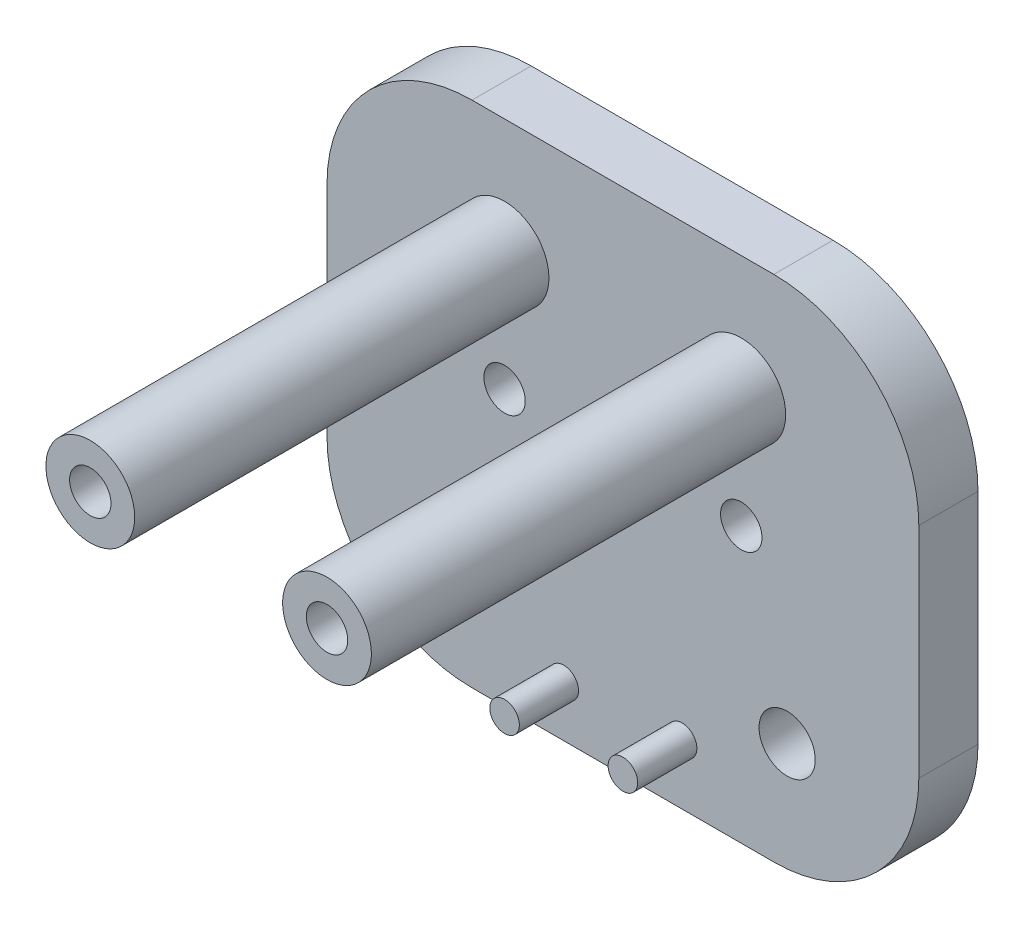
ISO-10303-21;
HEADER;
FILE_DESCRIPTION(('STEP AP214'),'2;1');
FILE_NAME('part.step','',(''),(''),'','','');
FILE_SCHEMA(('AUTOMOTIVE_DESIGN { 1 0 10303 214 1 1 1 1 }'));
ENDSEC;
DATA;
#1=APPLICATION_CONTEXT('core data for automotive mechanical design processes');
#2=APPLICATION_PROTOCOL_DEFINITION('international standard','automotive_design',2000,#1);
#3=PRODUCT_CONTEXT('',#1,'mechanical');
#4=PRODUCT('Part','Part','',(#3));
#5=PRODUCT_RELATED_PRODUCT_CATEGORY('part','',(#4));
#6=PRODUCT_DEFINITION_FORMATION('','',#4);
#7=PRODUCT_DEFINITION_CONTEXT('part definition',#1,'design');
#8=PRODUCT_DEFINITION('design','',#6,#7);
#9=PRODUCT_DEFINITION_SHAPE('','',#8);
#10=(LENGTH_UNIT() NAMED_UNIT(*) SI_UNIT(.MILLI.,.METRE.));
#11=(NAMED_UNIT(*) PLANE_ANGLE_UNIT() SI_UNIT($,.RADIAN.));
#12=(NAMED_UNIT(*) SI_UNIT($,.STERADIAN.) SOLID_ANGLE_UNIT());
#13=UNCERTAINTY_MEASURE_WITH_UNIT(LENGTH_MEASURE(1.E-05),#10,'distance_accuracy_value','');
#14=(GEOMETRIC_REPRESENTATION_CONTEXT(3) GLOBAL_UNCERTAINTY_ASSIGNED_CONTEXT((#13)) GLOBAL_UNIT_ASSIGNED_CONTEXT((#10,
#11,#12)) REPRESENTATION_CONTEXT('',''));
#15=CARTESIAN_POINT('',(0.,0.,0.));
#16=DIRECTION('',(0.,0.,1.));
#17=DIRECTION('',(1.,0.,0.));
#18=AXIS2_PLACEMENT_3D('',#15,#16,#17);
#19=CARTESIAN_POINT('',(-25.5,26.3663986315752,76.));
#20=DIRECTION('',(0.,0.,1.));
#21=DIRECTION('',(1.,0.,0.));
#22=AXIS2_PLACEMENT_3D('',#19,#20,#21);
#23=PLANE('',#22);
#24=CARTESIAN_POINT('',(-20.,46.4509224089446,76.));
#25=DIRECTION('',(0.,0.,1.));
#26=DIRECTION('',(1.,0.,0.));
#27=AXIS2_PLACEMENT_3D('',#24,#25,#26);
#28=CIRCLE('',#27,3.5);
#29=CARTESIAN_POINT('',(-16.5,46.4509224089446,76.));
#30=VERTEX_POINT('',#29);
#31=EDGE_CURVE('E198',#30,#30,#28,.T.);
#32=ORIENTED_EDGE('',*,*,#31,.F.);
#33=EDGE_LOOP('',(#32));
#34=FACE_BOUND('',#33,.T.);
#35=CARTESIAN_POINT('',(-20.,46.4509224089446,76.));
#36=DIRECTION('',(0.,0.,1.));
#37=DIRECTION('',(1.,0.,0.));
#38=AXIS2_PLACEMENT_3D('',#35,#36,#37);
#39=CIRCLE('',#38,7.5);
#40=CARTESIAN_POINT('',(-12.5,46.4509224089446,76.));
#41=VERTEX_POINT('',#40);
#42=EDGE_CURVE('E194',#41,#41,#39,.T.);
#43=ORIENTED_EDGE('',*,*,#42,.T.);
#44=EDGE_LOOP('',(#43));
#45=FACE_BOUND('',#44,.T.);
#46=ADVANCED_FACE('F44',(#34,#45),#23,.T.);
#47=CARTESIAN_POINT('',(-50.,66.,-4.));
#48=DIRECTION('',(0.,1.,0.));
#49=DIRECTION('',(0.,0.,1.));
#50=AXIS2_PLACEMENT_3D('',#47,#48,#49);
#51=PLANE('',#50);
#52=DIRECTION('',(-1.,0.,0.));
#53=VECTOR('',#52,1.);
#54=CARTESIAN_POINT('',(25.5,66.,6.00000000000001));
#55=LINE('',#54,#53);
#56=CARTESIAN_POINT('',(25.5,66.,6.00000000000001));
#57=VERTEX_POINT('',#56);
#58=CARTESIAN_POINT('',(-25.5,66.,6.00000000000001));
#59=VERTEX_POINT('',#58);
#60=EDGE_CURVE('E48',#57,#59,#55,.T.);
#61=ORIENTED_EDGE('',*,*,#60,.F.);
#62=DIRECTION('',(0.,0.,1.));
#63=VECTOR('',#62,1.);
#64=CARTESIAN_POINT('',(25.5,66.,-4.));
#65=LINE('',#64,#63);
#66=CARTESIAN_POINT('',(25.5,66.,-4.));
#67=VERTEX_POINT('',#66);
#68=EDGE_CURVE('E55',#57,#67,#65,.F.);
#69=ORIENTED_EDGE('',*,*,#68,.T.);
#70=DIRECTION('',(-1.,0.,0.));
#71=VECTOR('',#70,1.);
#72=CARTESIAN_POINT('',(-50.,66.,-4.));
#73=LINE('',#72,#71);
#74=CARTESIAN_POINT('',(-25.5,66.,-4.));
#75=VERTEX_POINT('',#74);
#76=EDGE_CURVE('E114',#67,#75,#73,.T.);
#77=ORIENTED_EDGE('',*,*,#76,.T.);
#78=DIRECTION('',(0.,0.,1.));
#79=VECTOR('',#78,1.);
#80=CARTESIAN_POINT('',(-25.5,66.,-4.));
#81=LINE('',#80,#79);
#82=EDGE_CURVE('E12',#75,#59,#81,.T.);
#83=ORIENTED_EDGE('',*,*,#82,.T.);
#84=EDGE_LOOP('',(#61,#69,#77,#83));
#85=FACE_BOUND('',#84,.T.);
#86=ADVANCED_FACE('F113',(#85),#51,.T.);
#87=CARTESIAN_POINT('',(-25.5,41.5,-4.));
#88=DIRECTION('',(0.,0.,1.));
#89=DIRECTION('',(1.,0.,0.));
#90=AXIS2_PLACEMENT_3D('',#87,#88,#89);
#91=CYLINDRICAL_SURFACE('',#90,24.5);
#92=CARTESIAN_POINT('',(-25.5,41.5,6.));
#93=DIRECTION('',(0.,0.,-1.));
#94=DIRECTION('',(-1.,0.,0.));
#95=AXIS2_PLACEMENT_3D('',#92,#93,#94);
#96=CIRCLE('',#95,24.5);
#97=CARTESIAN_POINT('',(-50.,41.5,6.));
#98=VERTEX_POINT('',#97);
#99=EDGE_CURVE('E96',#59,#98,#96,.F.);
#100=ORIENTED_EDGE('',*,*,#99,.F.);
#101=ORIENTED_EDGE('',*,*,#82,.F.);
#102=CARTESIAN_POINT('',(-25.5,41.5,-4.));
#103=DIRECTION('',(0.,0.,-1.));
#104=DIRECTION('',(-1.,0.,0.));
#105=AXIS2_PLACEMENT_3D('',#102,#103,#104);
#106=CIRCLE('',#105,24.5);
#107=CARTESIAN_POINT('',(-50.,41.5,-4.));
#108=VERTEX_POINT('',#107);
#109=EDGE_CURVE('E64',#108,#75,#106,.T.);
#110=ORIENTED_EDGE('',*,*,#109,.F.);
#111=DIRECTION('',(0.,0.,1.));
#112=VECTOR('',#111,1.);
#113=CARTESIAN_POINT('',(-50.,41.5,-4.));
#114=LINE('',#113,#112);
#115=EDGE_CURVE('E100',#98,#108,#114,.F.);
#116=ORIENTED_EDGE('',*,*,#115,.F.);
#117=EDGE_LOOP('',(#100,#101,#110,#116));
#118=FACE_BOUND('',#117,.T.);
#119=ADVANCED_FACE('F97',(#118),#91,.T.);
#120=CARTESIAN_POINT('',(25.5,41.5,-4.));
#121=DIRECTION('',(0.,0.,1.));
#122=DIRECTION('',(1.,0.,0.));
#123=AXIS2_PLACEMENT_3D('',#120,#121,#122);
#124=CYLINDRICAL_SURFACE('',#123,24.5);
#125=ORIENTED_EDGE('',*,*,#68,.F.);
#126=CARTESIAN_POINT('',(25.5,41.5,6.));
#127=DIRECTION('',(0.,0.,-1.));
#128=DIRECTION('',(-1.,0.,0.));
#129=AXIS2_PLACEMENT_3D('',#126,#127,#128);
#130=CIRCLE('',#129,24.5);
#131=CARTESIAN_POINT('',(50.,41.5,6.));
#132=VERTEX_POINT('',#131);
#133=EDGE_CURVE('E86',#132,#57,#130,.F.);
#134=ORIENTED_EDGE('',*,*,#133,.F.);
#135=DIRECTION('',(0.,0.,1.));
#136=VECTOR('',#135,1.);
#137=CARTESIAN_POINT('',(50.,41.5,-4.));
#138=LINE('',#137,#136);
#139=CARTESIAN_POINT('',(50.,41.5,-4.));
#140=VERTEX_POINT('',#139);
#141=EDGE_CURVE('E135',#140,#132,#138,.T.);
#142=ORIENTED_EDGE('',*,*,#141,.F.);
#143=CARTESIAN_POINT('',(25.5,41.5,-4.));
#144=DIRECTION('',(0.,0.,-1.));
#145=DIRECTION('',(-1.,0.,0.));
#146=AXIS2_PLACEMENT_3D('',#143,#144,#145);
#147=CIRCLE('',#146,24.5);
#148=EDGE_CURVE('E131',#67,#140,#147,.T.);
#149=ORIENTED_EDGE('',*,*,#148,.F.);
#150=EDGE_LOOP('',(#125,#134,#142,#149));
#151=FACE_BOUND('',#150,.T.);
#152=ADVANCED_FACE('F46',(#151),#124,.T.);
#153=CARTESIAN_POINT('',(50.,-25.,-4.));
#154=DIRECTION('',(1.,0.,0.));
#155=DIRECTION('',(0.,0.,-1.));
#156=AXIS2_PLACEMENT_3D('',#153,#154,#155);
#157=PLANE('',#156);
#158=DIRECTION('',(0.,1.,0.));
#159=VECTOR('',#158,1.);
#160=CARTESIAN_POINT('',(50.,-25.,6.));
#161=LINE('',#160,#159);
#162=CARTESIAN_POINT('',(50.,4.5,6.));
#163=VERTEX_POINT('',#162);
#164=EDGE_CURVE('E225',#163,#132,#161,.T.);
#165=ORIENTED_EDGE('',*,*,#164,.F.);
#166=DIRECTION('',(0.,0.,1.));
#167=VECTOR('',#166,1.);
#168=CARTESIAN_POINT('',(50.,4.5,-4.));
#169=LINE('',#168,#167);
#170=CARTESIAN_POINT('',(50.,4.5,-4.));
#171=VERTEX_POINT('',#170);
#172=EDGE_CURVE('E134',#163,#171,#169,.F.);
#173=ORIENTED_EDGE('',*,*,#172,.T.);
#174=DIRECTION('',(0.,1.,0.));
#175=VECTOR('',#174,1.);
#176=CARTESIAN_POINT('',(50.,-25.,-4.));
#177=LINE('',#176,#175);
#178=EDGE_CURVE('E118',#171,#140,#177,.T.);
#179=ORIENTED_EDGE('',*,*,#178,.T.);
#180=ORIENTED_EDGE('',*,*,#141,.T.);
#181=EDGE_LOOP('',(#165,#173,#179,#180));
#182=FACE_BOUND('',#181,.T.);
#183=ADVANCED_FACE('F257',(#182),#157,.T.);
#184=CARTESIAN_POINT('',(0.,0.,6.));
#185=DIRECTION('',(0.,0.,-1.));
#186=DIRECTION('',(-1.,0.,0.));
#187=AXIS2_PLACEMENT_3D('',#184,#185,#186);
#188=PLANE('',#187);
#189=CARTESIAN_POINT('',(20.,26.4509224089446,6.));
#190=DIRECTION('',(0.,0.,-1.));
#191=DIRECTION('',(-1.,0.,0.));
#192=AXIS2_PLACEMENT_3D('',#189,#190,#191);
#193=CIRCLE('',#192,3.5);
#194=CARTESIAN_POINT('',(16.5,26.4509224089446,6.));
#195=VERTEX_POINT('',#194);
#196=EDGE_CURVE('E184',#195,#195,#193,.F.);
#197=ORIENTED_EDGE('',*,*,#196,.F.);
#198=EDGE_LOOP('',(#197));
#199=FACE_BOUND('',#198,.T.);
#200=CARTESIAN_POINT('',(-20.,26.4509224089446,6.));
#201=DIRECTION('',(0.,0.,-1.));
#202=DIRECTION('',(-1.,0.,0.));
#203=AXIS2_PLACEMENT_3D('',#200,#201,#202);
#204=CIRCLE('',#203,3.5);
#205=CARTESIAN_POINT('',(-23.5,26.4509224089446,6.));
#206=VERTEX_POINT('',#205);
#207=EDGE_CURVE('E385',#206,#206,#204,.F.);
#208=ORIENTED_EDGE('',*,*,#207,.F.);
#209=EDGE_LOOP('',(#208));
#210=FACE_BOUND('',#209,.T.);
#211=CARTESIAN_POINT('',(-20.,46.4509224089446,6.));
#212=DIRECTION('',(0.,0.,1.));
#213=DIRECTION('',(1.,0.,0.));
#214=AXIS2_PLACEMENT_3D('',#211,#212,#213);
#215=CIRCLE('',#214,7.5);
#216=CARTESIAN_POINT('',(-12.5,46.4509224089446,6.));
#217=VERTEX_POINT('',#216);
#218=EDGE_CURVE('E111',#217,#217,#215,.T.);
#219=ORIENTED_EDGE('',*,*,#218,.F.);
#220=EDGE_LOOP('',(#219));
#221=FACE_BOUND('',#220,.T.);
#222=CARTESIAN_POINT('',(20.,46.4509224089446,6.));
#223=DIRECTION('',(0.,0.,1.));
#224=DIRECTION('',(1.,0.,0.));
#225=AXIS2_PLACEMENT_3D('',#222,#223,#224);
#226=CIRCLE('',#225,7.5);
#227=CARTESIAN_POINT('',(27.5,46.4509224089446,6.));
#228=VERTEX_POINT('',#227);
#229=EDGE_CURVE('E190',#228,#228,#226,.T.);
#230=ORIENTED_EDGE('',*,*,#229,.F.);
#231=EDGE_LOOP('',(#230));
#232=FACE_BOUND('',#231,.T.);
#233=ORIENTED_EDGE('',*,*,#133,.T.);
#234=ORIENTED_EDGE('',*,*,#60,.T.);
#235=ORIENTED_EDGE('',*,*,#99,.T.);
#236=DIRECTION('',(0.,-1.,0.));
#237=VECTOR('',#236,1.);
#238=CARTESIAN_POINT('',(-50.,-25.,6.));
#239=LINE('',#238,#237);
#240=CARTESIAN_POINT('',(-50.,4.5,6.));
#241=VERTEX_POINT('',#240);
#242=EDGE_CURVE('E172',#98,#241,#239,.T.);
#243=ORIENTED_EDGE('',*,*,#242,.T.);
#244=CARTESIAN_POINT('',(-25.5,4.5,6.));
#245=DIRECTION('',(0.,0.,-1.));
#246=DIRECTION('',(-1.,0.,0.));
#247=AXIS2_PLACEMENT_3D('',#244,#245,#246);
#248=CIRCLE('',#247,24.5);
#249=CARTESIAN_POINT('',(-25.5,-20.,6.));
#250=VERTEX_POINT('',#249);
#251=EDGE_CURVE('E104',#241,#250,#248,.F.);
#252=ORIENTED_EDGE('',*,*,#251,.T.);
#253=DIRECTION('',(1.,0.,0.));
#254=VECTOR('',#253,1.);
#255=CARTESIAN_POINT('',(-50.,-20.,6.));
#256=LINE('',#255,#254);
#257=CARTESIAN_POINT('',(25.5,-20.,6.));
#258=VERTEX_POINT('',#257);
#259=EDGE_CURVE('E126',#250,#258,#256,.T.);
#260=ORIENTED_EDGE('',*,*,#259,.T.);
#261=CARTESIAN_POINT('',(25.5,4.5,6.));
#262=DIRECTION('',(0.,0.,-1.));
#263=DIRECTION('',(-1.,0.,0.));
#264=AXIS2_PLACEMENT_3D('',#261,#262,#263);
#265=CIRCLE('',#264,24.5);
#266=EDGE_CURVE('E138',#258,#163,#265,.F.);
#267=ORIENTED_EDGE('',*,*,#266,.T.);
#268=ORIENTED_EDGE('',*,*,#164,.T.);
#269=EDGE_LOOP('',(#233,#234,#235,#243,#252,#260,#267,#268));
#270=FACE_BOUND('',#269,.T.);
#271=CARTESIAN_POINT('',(10.0007616428665,-9.89206900548158,6.));
#272=DIRECTION('',(0.,0.,-1.));
#273=DIRECTION('',(-1.,0.,0.));
#274=AXIS2_PLACEMENT_3D('',#271,#272,#273);
#275=CIRCLE('',#274,2.49999999999991);
#276=CARTESIAN_POINT('',(7.5007616428666,-9.89206900548158,6.));
#277=VERTEX_POINT('',#276);
#278=EDGE_CURVE('E396',#277,#277,#275,.T.);
#279=ORIENTED_EDGE('',*,*,#278,.T.);
#280=EDGE_LOOP('',(#279));
#281=FACE_BOUND('',#280,.T.);
#282=CARTESIAN_POINT('',(-9.99923835713153,-11.4411465965339,6.));
#283=DIRECTION('',(0.,0.,-1.));
#284=DIRECTION('',(-1.,0.,0.));
#285=AXIS2_PLACEMENT_3D('',#282,#283,#284);
#286=CIRCLE('',#285,2.50000000000109);
#287=CARTESIAN_POINT('',(-12.4992383571326,-11.4411465965339,6.));
#288=VERTEX_POINT('',#287);
#289=EDGE_CURVE('E220',#288,#288,#286,.T.);
#290=ORIENTED_EDGE('',*,*,#289,.T.);
#291=EDGE_LOOP('',(#290));
#292=FACE_BOUND('',#291,.T.);
#293=CARTESIAN_POINT('',(-27.75,-1.55,6.));
#294=DIRECTION('',(0.,0.,1.));
#295=DIRECTION('',(1.,0.,0.));
#296=AXIS2_PLACEMENT_3D('',#293,#294,#295);
#297=CIRCLE('',#296,4.75);
#298=CARTESIAN_POINT('',(-23.,-1.55,6.));
#299=VERTEX_POINT('',#298);
#300=EDGE_CURVE('E216',#299,#299,#297,.T.);
#301=ORIENTED_EDGE('',*,*,#300,.F.);
#302=EDGE_LOOP('',(#301));
#303=FACE_BOUND('',#302,.T.);
#304=CARTESIAN_POINT('',(27.75,-1.55,6.));
#305=DIRECTION('',(0.,0.,1.));
#306=DIRECTION('',(1.,0.,0.));
#307=AXIS2_PLACEMENT_3D('',#304,#305,#306);
#308=CIRCLE('',#307,4.75);
#309=CARTESIAN_POINT('',(32.5,-1.55,6.));
#310=VERTEX_POINT('',#309);
#311=EDGE_CURVE('E215',#310,#310,#308,.T.);
#312=ORIENTED_EDGE('',*,*,#311,.F.);
#313=EDGE_LOOP('',(#312));
#314=FACE_BOUND('',#313,.T.);
#315=ADVANCED_FACE('F106',(#199,#210,#221,#232,#270,#281,#292,#303,#314),#188,.F.);
#316=CARTESIAN_POINT('',(-50.,-20.,-4.));
#317=DIRECTION('',(0.,-1.,0.));
#318=DIRECTION('',(0.,0.,-1.));
#319=AXIS2_PLACEMENT_3D('',#316,#317,#318);
#320=PLANE('',#319);
#321=DIRECTION('',(1.,0.,0.));
#322=VECTOR('',#321,1.);
#323=CARTESIAN_POINT('',(-50.,-20.,-4.));
#324=LINE('',#323,#322);
#325=CARTESIAN_POINT('',(-25.5,-20.,-4.));
#326=VERTEX_POINT('',#325);
#327=CARTESIAN_POINT('',(25.5,-20.,-4.));
#328=VERTEX_POINT('',#327);
#329=EDGE_CURVE('E123',#326,#328,#324,.T.);
#330=ORIENTED_EDGE('',*,*,#329,.T.);
#331=DIRECTION('',(0.,0.,1.));
#332=VECTOR('',#331,1.);
#333=CARTESIAN_POINT('',(25.5,-20.,-4.));
#334=LINE('',#333,#332);
#335=EDGE_CURVE('E140',#328,#258,#334,.T.);
#336=ORIENTED_EDGE('',*,*,#335,.T.);
#337=ORIENTED_EDGE('',*,*,#259,.F.);
#338=DIRECTION('',(0.,0.,1.));
#339=VECTOR('',#338,1.);
#340=CARTESIAN_POINT('',(-25.5,-20.,-4.));
#341=LINE('',#340,#339);
#342=EDGE_CURVE('E143',#250,#326,#341,.F.);
#343=ORIENTED_EDGE('',*,*,#342,.T.);
#344=EDGE_LOOP('',(#330,#336,#337,#343));
#345=FACE_BOUND('',#344,.T.);
#346=ADVANCED_FACE('F262',(#345),#320,.T.);
#347=CARTESIAN_POINT('',(-50.,-25.,-4.));
#348=DIRECTION('',(-1.,0.,0.));
#349=DIRECTION('',(0.,0.,1.));
#350=AXIS2_PLACEMENT_3D('',#347,#348,#349);
#351=PLANE('',#350);
#352=DIRECTION('',(0.,-1.,0.));
#353=VECTOR('',#352,1.);
#354=CARTESIAN_POINT('',(-50.,-25.,-4.));
#355=LINE('',#354,#353);
#356=CARTESIAN_POINT('',(-50.,4.5,-4.));
#357=VERTEX_POINT('',#356);
#358=EDGE_CURVE('E117',#108,#357,#355,.T.);
#359=ORIENTED_EDGE('',*,*,#358,.T.);
#360=DIRECTION('',(0.,0.,1.));
#361=VECTOR('',#360,1.);
#362=CARTESIAN_POINT('',(-50.,4.5,-4.));
#363=LINE('',#362,#361);
#364=EDGE_CURVE('E164',#357,#241,#363,.T.);
#365=ORIENTED_EDGE('',*,*,#364,.T.);
#366=ORIENTED_EDGE('',*,*,#242,.F.);
#367=ORIENTED_EDGE('',*,*,#115,.T.);
#368=EDGE_LOOP('',(#359,#365,#366,#367));
#369=FACE_BOUND('',#368,.T.);
#370=ADVANCED_FACE('F232',(#369),#351,.T.);
#371=CARTESIAN_POINT('',(0.,0.,-4.));
#372=DIRECTION('',(0.,0.,-1.));
#373=DIRECTION('',(-1.,0.,0.));
#374=AXIS2_PLACEMENT_3D('',#371,#372,#373);
#375=PLANE('',#374);
#376=CARTESIAN_POINT('',(20.,26.4509224089446,-4.));
#377=DIRECTION('',(0.,0.,-1.));
#378=DIRECTION('',(-1.,0.,0.));
#379=AXIS2_PLACEMENT_3D('',#376,#377,#378);
#380=CIRCLE('',#379,3.5);
#381=CARTESIAN_POINT('',(16.5,26.4509224089446,-4.));
#382=VERTEX_POINT('',#381);
#383=EDGE_CURVE('E365',#382,#382,#380,.T.);
#384=ORIENTED_EDGE('',*,*,#383,.F.);
#385=EDGE_LOOP('',(#384));
#386=FACE_BOUND('',#385,.T.);
#387=CARTESIAN_POINT('',(-20.,26.4509224089446,-4.));
#388=DIRECTION('',(0.,0.,-1.));
#389=DIRECTION('',(-1.,0.,0.));
#390=AXIS2_PLACEMENT_3D('',#387,#388,#389);
#391=CIRCLE('',#390,3.5);
#392=CARTESIAN_POINT('',(-23.5,26.4509224089446,-4.));
#393=VERTEX_POINT('',#392);
#394=EDGE_CURVE('E369',#393,#393,#391,.T.);
#395=ORIENTED_EDGE('',*,*,#394,.F.);
#396=EDGE_LOOP('',(#395));
#397=FACE_BOUND('',#396,.T.);
#398=CARTESIAN_POINT('',(-20.,46.4509224089446,-4.));
#399=DIRECTION('',(0.,0.,1.));
#400=DIRECTION('',(1.,0.,0.));
#401=AXIS2_PLACEMENT_3D('',#398,#399,#400);
#402=CIRCLE('',#401,3.5);
#403=CARTESIAN_POINT('',(-16.5,46.4509224089446,-4.));
#404=VERTEX_POINT('',#403);
#405=EDGE_CURVE('E112',#404,#404,#402,.T.);
#406=ORIENTED_EDGE('',*,*,#405,.T.);
#407=EDGE_LOOP('',(#406));
#408=FACE_BOUND('',#407,.T.);
#409=CARTESIAN_POINT('',(20.,46.4509224089446,-4.));
#410=DIRECTION('',(0.,0.,1.));
#411=DIRECTION('',(1.,0.,0.));
#412=AXIS2_PLACEMENT_3D('',#409,#410,#411);
#413=CIRCLE('',#412,3.5);
#414=CARTESIAN_POINT('',(23.5,46.4509224089446,-4.));
#415=VERTEX_POINT('',#414);
#416=EDGE_CURVE('E183',#415,#415,#413,.T.);
#417=ORIENTED_EDGE('',*,*,#416,.T.);
#418=EDGE_LOOP('',(#417));
#419=FACE_BOUND('',#418,.T.);
#420=CARTESIAN_POINT('',(27.75,-1.55,-4.));
#421=DIRECTION('',(0.,0.,1.));
#422=DIRECTION('',(1.,0.,0.));
#423=AXIS2_PLACEMENT_3D('',#420,#421,#422);
#424=CIRCLE('',#423,4.75);
#425=CARTESIAN_POINT('',(32.5,-1.55,-4.));
#426=VERTEX_POINT('',#425);
#427=EDGE_CURVE('E221',#426,#426,#424,.T.);
#428=ORIENTED_EDGE('',*,*,#427,.T.);
#429=EDGE_LOOP('',(#428));
#430=FACE_BOUND('',#429,.T.);
#431=CARTESIAN_POINT('',(-27.75,-1.55,-4.));
#432=DIRECTION('',(0.,0.,1.));
#433=DIRECTION('',(1.,0.,0.));
#434=AXIS2_PLACEMENT_3D('',#431,#432,#433);
#435=CIRCLE('',#434,4.75);
#436=CARTESIAN_POINT('',(-23.,-1.55,-4.));
#437=VERTEX_POINT('',#436);
#438=EDGE_CURVE('E211',#437,#437,#435,.T.);
#439=ORIENTED_EDGE('',*,*,#438,.T.);
#440=EDGE_LOOP('',(#439));
#441=FACE_BOUND('',#440,.T.);
#442=ORIENTED_EDGE('',*,*,#178,.F.);
#443=CARTESIAN_POINT('',(25.5,4.5,-4.));
#444=DIRECTION('',(0.,0.,-1.));
#445=DIRECTION('',(-1.,0.,0.));
#446=AXIS2_PLACEMENT_3D('',#443,#444,#445);
#447=CIRCLE('',#446,24.5);
#448=EDGE_CURVE('E154',#171,#328,#447,.T.);
#449=ORIENTED_EDGE('',*,*,#448,.T.);
#450=ORIENTED_EDGE('',*,*,#329,.F.);
#451=CARTESIAN_POINT('',(-25.5,4.5,-4.));
#452=DIRECTION('',(0.,0.,-1.));
#453=DIRECTION('',(-1.,0.,0.));
#454=AXIS2_PLACEMENT_3D('',#451,#452,#453);
#455=CIRCLE('',#454,24.5);
#456=EDGE_CURVE('E158',#326,#357,#455,.T.);
#457=ORIENTED_EDGE('',*,*,#456,.T.);
#458=ORIENTED_EDGE('',*,*,#358,.F.);
#459=ORIENTED_EDGE('',*,*,#109,.T.);
#460=ORIENTED_EDGE('',*,*,#76,.F.);
#461=ORIENTED_EDGE('',*,*,#148,.T.);
#462=EDGE_LOOP('',(#442,#449,#450,#457,#458,#459,#460,#461));
#463=FACE_BOUND('',#462,.T.);
#464=ADVANCED_FACE('F235',(#386,#397,#408,#419,#430,#441,#463),#375,.T.);
#465=CARTESIAN_POINT('',(-27.75,-1.55,-4.));
#466=DIRECTION('',(0.,0.,1.));
#467=DIRECTION('',(1.,0.,0.));
#468=AXIS2_PLACEMENT_3D('',#465,#466,#467);
#469=CYLINDRICAL_SURFACE('',#468,4.75);
#470=ORIENTED_EDGE('',*,*,#438,.F.);
#471=EDGE_LOOP('',(#470));
#472=FACE_BOUND('',#471,.T.);
#473=ORIENTED_EDGE('',*,*,#300,.T.);
#474=EDGE_LOOP('',(#473));
#475=FACE_BOUND('',#474,.T.);
#476=ADVANCED_FACE('F314',(#472,#475),#469,.F.);
#477=CARTESIAN_POINT('',(27.75,-1.55,-4.));
#478=DIRECTION('',(0.,0.,1.));
#479=DIRECTION('',(1.,0.,0.));
#480=AXIS2_PLACEMENT_3D('',#477,#478,#479);
#481=CYLINDRICAL_SURFACE('',#480,4.75);
#482=ORIENTED_EDGE('',*,*,#427,.F.);
#483=EDGE_LOOP('',(#482));
#484=FACE_BOUND('',#483,.T.);
#485=ORIENTED_EDGE('',*,*,#311,.T.);
#486=EDGE_LOOP('',(#485));
#487=FACE_BOUND('',#486,.T.);
#488=ADVANCED_FACE('F317',(#484,#487),#481,.F.);
#489=CARTESIAN_POINT('',(-9.99923835713153,-11.4411465965339,16.));
#490=DIRECTION('',(0.,0.,-1.));
#491=DIRECTION('',(-1.,0.,0.));
#492=AXIS2_PLACEMENT_3D('',#489,#490,#491);
#493=CYLINDRICAL_SURFACE('',#492,2.50000000000109);
#494=CARTESIAN_POINT('',(-9.99923835713153,-11.4411465965339,16.));
#495=DIRECTION('',(0.,0.,-1.));
#496=DIRECTION('',(-1.,0.,0.));
#497=AXIS2_PLACEMENT_3D('',#494,#495,#496);
#498=CIRCLE('',#497,2.50000000000109);
#499=CARTESIAN_POINT('',(-12.4992383571326,-11.4411465965339,16.));
#500=VERTEX_POINT('',#499);
#501=EDGE_CURVE('E400',#500,#500,#498,.T.);
#502=ORIENTED_EDGE('',*,*,#501,.T.);
#503=EDGE_LOOP('',(#502));
#504=FACE_BOUND('',#503,.T.);
#505=ORIENTED_EDGE('',*,*,#289,.F.);
#506=EDGE_LOOP('',(#505));
#507=FACE_BOUND('',#506,.T.);
#508=ADVANCED_FACE('F321',(#504,#507),#493,.T.);
#509=CARTESIAN_POINT('',(-9.99923835713153,-11.4411465965339,16.));
#510=DIRECTION('',(0.,0.,-1.));
#511=DIRECTION('',(-1.,0.,0.));
#512=AXIS2_PLACEMENT_3D('',#509,#510,#511);
#513=PLANE('',#512);
#514=ORIENTED_EDGE('',*,*,#501,.F.);
#515=EDGE_LOOP('',(#514));
#516=FACE_BOUND('',#515,.T.);
#517=ADVANCED_FACE('F346',(#516),#513,.F.);
#518=CARTESIAN_POINT('',(10.0007616428665,-9.89206900548158,16.));
#519=DIRECTION('',(0.,0.,-1.));
#520=DIRECTION('',(-1.,0.,0.));
#521=AXIS2_PLACEMENT_3D('',#518,#519,#520);
#522=CYLINDRICAL_SURFACE('',#521,2.49999999999991);
#523=CARTESIAN_POINT('',(10.0007616428665,-9.89206900548158,16.));
#524=DIRECTION('',(0.,0.,-1.));
#525=DIRECTION('',(-1.,0.,0.));
#526=AXIS2_PLACEMENT_3D('',#523,#524,#525);
#527=CIRCLE('',#526,2.49999999999991);
#528=CARTESIAN_POINT('',(7.5007616428666,-9.89206900548158,16.));
#529=VERTEX_POINT('',#528);
#530=EDGE_CURVE('E189',#529,#529,#527,.T.);
#531=ORIENTED_EDGE('',*,*,#530,.T.);
#532=EDGE_LOOP('',(#531));
#533=FACE_BOUND('',#532,.T.);
#534=ORIENTED_EDGE('',*,*,#278,.F.);
#535=EDGE_LOOP('',(#534));
#536=FACE_BOUND('',#535,.T.);
#537=ADVANCED_FACE('F340',(#533,#536),#522,.T.);
#538=CARTESIAN_POINT('',(10.0007616428665,-9.89206900548158,16.));
#539=DIRECTION('',(0.,0.,-1.));
#540=DIRECTION('',(-1.,0.,0.));
#541=AXIS2_PLACEMENT_3D('',#538,#539,#540);
#542=PLANE('',#541);
#543=ORIENTED_EDGE('',*,*,#530,.F.);
#544=EDGE_LOOP('',(#543));
#545=FACE_BOUND('',#544,.T.);
#546=ADVANCED_FACE('F336',(#545),#542,.F.);
#547=CARTESIAN_POINT('',(25.5,4.5,-4.));
#548=DIRECTION('',(0.,0.,1.));
#549=DIRECTION('',(1.,0.,0.));
#550=AXIS2_PLACEMENT_3D('',#547,#548,#549);
#551=CYLINDRICAL_SURFACE('',#550,24.5);
#552=ORIENTED_EDGE('',*,*,#448,.F.);
#553=ORIENTED_EDGE('',*,*,#172,.F.);
#554=ORIENTED_EDGE('',*,*,#266,.F.);
#555=ORIENTED_EDGE('',*,*,#335,.F.);
#556=EDGE_LOOP('',(#552,#553,#554,#555));
#557=FACE_BOUND('',#556,.T.);
#558=ADVANCED_FACE('F261',(#557),#551,.T.);
#559=CARTESIAN_POINT('',(-25.5,4.5,-4.));
#560=DIRECTION('',(0.,0.,1.));
#561=DIRECTION('',(1.,0.,0.));
#562=AXIS2_PLACEMENT_3D('',#559,#560,#561);
#563=CYLINDRICAL_SURFACE('',#562,24.5);
#564=ORIENTED_EDGE('',*,*,#456,.F.);
#565=ORIENTED_EDGE('',*,*,#342,.F.);
#566=ORIENTED_EDGE('',*,*,#251,.F.);
#567=ORIENTED_EDGE('',*,*,#364,.F.);
#568=EDGE_LOOP('',(#564,#565,#566,#567));
#569=FACE_BOUND('',#568,.T.);
#570=ADVANCED_FACE('F243',(#569),#563,.T.);
#571=CARTESIAN_POINT('',(20.,46.4509224089446,76.));
#572=DIRECTION('',(0.,0.,1.));
#573=DIRECTION('',(1.,0.,0.));
#574=AXIS2_PLACEMENT_3D('',#571,#572,#573);
#575=CIRCLE('',#574,3.5);
#576=CARTESIAN_POINT('',(23.5,46.4509224089446,76.));
#577=VERTEX_POINT('',#576);
#578=EDGE_CURVE('E179',#577,#577,#575,.T.);
#579=ORIENTED_EDGE('',*,*,#578,.F.);
#580=EDGE_LOOP('',(#579));
#581=FACE_BOUND('',#580,.T.);
#582=CARTESIAN_POINT('',(20.,46.4509224089446,76.));
#583=DIRECTION('',(0.,0.,1.));
#584=DIRECTION('',(1.,0.,0.));
#585=AXIS2_PLACEMENT_3D('',#582,#583,#584);
#586=CIRCLE('',#585,7.5);
#587=CARTESIAN_POINT('',(27.5,46.4509224089446,76.));
#588=VERTEX_POINT('',#587);
#589=EDGE_CURVE('E185',#588,#588,#586,.T.);
#590=ORIENTED_EDGE('',*,*,#589,.T.);
#591=EDGE_LOOP('',(#590));
#592=FACE_BOUND('',#591,.T.);
#593=ADVANCED_FACE('F277',(#581,#592),#23,.T.);
#594=CARTESIAN_POINT('',(20.,46.4509224089446,97.2132034355964));
#595=DIRECTION('',(0.,0.,-1.));
#596=DIRECTION('',(-1.,0.,0.));
#597=AXIS2_PLACEMENT_3D('',#594,#595,#596);
#598=CYLINDRICAL_SURFACE('',#597,7.5);
#599=ORIENTED_EDGE('',*,*,#229,.T.);
#600=EDGE_LOOP('',(#599));
#601=FACE_BOUND('',#600,.T.);
#602=ORIENTED_EDGE('',*,*,#589,.F.);
#603=EDGE_LOOP('',(#602));
#604=FACE_BOUND('',#603,.T.);
#605=ADVANCED_FACE('F285',(#601,#604),#598,.T.);
#606=CARTESIAN_POINT('',(-20.,46.4509224089446,97.2132034355964));
#607=DIRECTION('',(0.,0.,-1.));
#608=DIRECTION('',(-1.,0.,0.));
#609=AXIS2_PLACEMENT_3D('',#606,#607,#608);
#610=CYLINDRICAL_SURFACE('',#609,7.5);
#611=ORIENTED_EDGE('',*,*,#218,.T.);
#612=EDGE_LOOP('',(#611));
#613=FACE_BOUND('',#612,.T.);
#614=ORIENTED_EDGE('',*,*,#42,.F.);
#615=EDGE_LOOP('',(#614));
#616=FACE_BOUND('',#615,.T.);
#617=ADVANCED_FACE('F291',(#613,#616),#610,.T.);
#618=CARTESIAN_POINT('',(20.,46.4509224089446,-4.));
#619=DIRECTION('',(0.,0.,1.));
#620=DIRECTION('',(1.,0.,0.));
#621=AXIS2_PLACEMENT_3D('',#618,#619,#620);
#622=CYLINDRICAL_SURFACE('',#621,3.5);
#623=ORIENTED_EDGE('',*,*,#416,.F.);
#624=EDGE_LOOP('',(#623));
#625=FACE_BOUND('',#624,.T.);
#626=ORIENTED_EDGE('',*,*,#578,.T.);
#627=EDGE_LOOP('',(#626));
#628=FACE_BOUND('',#627,.T.);
#629=ADVANCED_FACE('F298',(#625,#628),#622,.F.);
#630=CARTESIAN_POINT('',(-20.,46.4509224089446,-4.));
#631=DIRECTION('',(0.,0.,1.));
#632=DIRECTION('',(1.,0.,0.));
#633=AXIS2_PLACEMENT_3D('',#630,#631,#632);
#634=CYLINDRICAL_SURFACE('',#633,3.5);
#635=ORIENTED_EDGE('',*,*,#405,.F.);
#636=EDGE_LOOP('',(#635));
#637=FACE_BOUND('',#636,.T.);
#638=ORIENTED_EDGE('',*,*,#31,.T.);
#639=EDGE_LOOP('',(#638));
#640=FACE_BOUND('',#639,.T.);
#641=ADVANCED_FACE('F300',(#637,#640),#634,.F.);
#642=CARTESIAN_POINT('',(-20.,26.4509224089446,15.8994949366117));
#643=DIRECTION('',(0.,0.,-1.));
#644=DIRECTION('',(-1.,0.,0.));
#645=AXIS2_PLACEMENT_3D('',#642,#643,#644);
#646=CYLINDRICAL_SURFACE('',#645,3.5);
#647=ORIENTED_EDGE('',*,*,#207,.T.);
#648=EDGE_LOOP('',(#647));
#649=FACE_BOUND('',#648,.T.);
#650=ORIENTED_EDGE('',*,*,#394,.T.);
#651=EDGE_LOOP('',(#650));
#652=FACE_BOUND('',#651,.T.);
#653=ADVANCED_FACE('F307',(#649,#652),#646,.F.);
#654=CARTESIAN_POINT('',(20.,26.4509224089446,15.8994949366117));
#655=DIRECTION('',(0.,0.,-1.));
#656=DIRECTION('',(-1.,0.,0.));
#657=AXIS2_PLACEMENT_3D('',#654,#655,#656);
#658=CYLINDRICAL_SURFACE('',#657,3.5);
#659=ORIENTED_EDGE('',*,*,#196,.T.);
#660=EDGE_LOOP('',(#659));
#661=FACE_BOUND('',#660,.T.);
#662=ORIENTED_EDGE('',*,*,#383,.T.);
#663=EDGE_LOOP('',(#662));
#664=FACE_BOUND('',#663,.T.);
#665=ADVANCED_FACE('F414',(#661,#664),#658,.F.);
#666=CLOSED_SHELL('',(#46,#86,#119,#152,#183,#315,#346,#370,#464,#476,#488,#508,#517,#537,#546,
#558,#570,#593,#605,#617,#629,#641,#653,#665));
#667=MANIFOLD_SOLID_BREP('B2',#666);
#668=ADVANCED_BREP_SHAPE_REPRESENTATION('',(#18,#667),#14);
#669=SHAPE_DEFINITION_REPRESENTATION(#9,#668);
ENDSEC;
END-ISO-10303-21;
